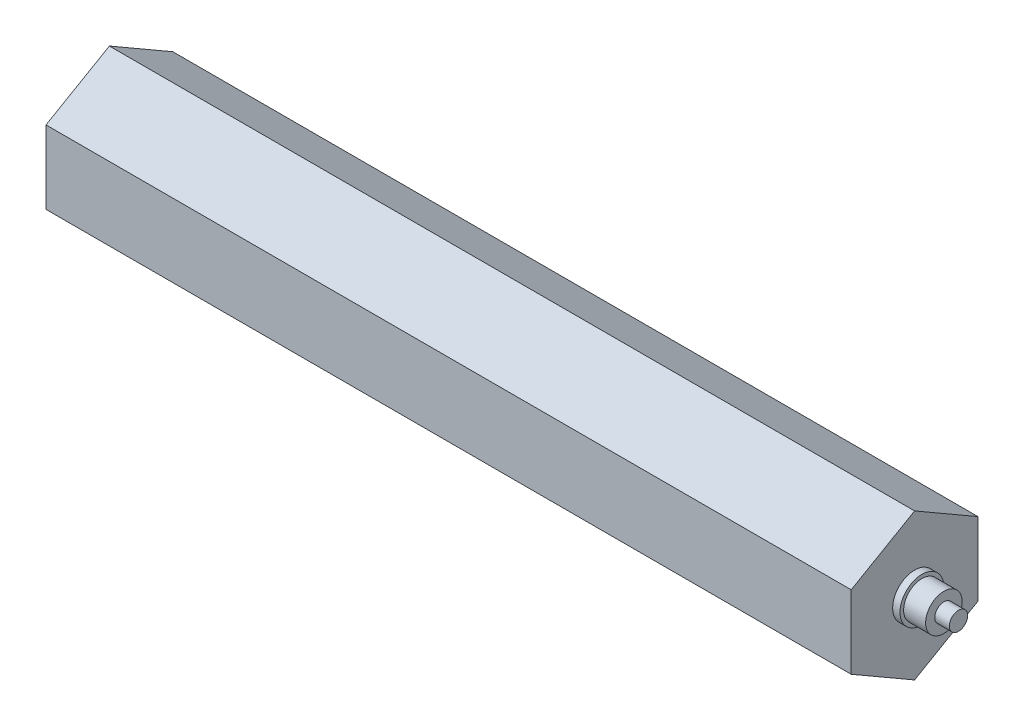
ISO-10303-21;
HEADER;
FILE_DESCRIPTION(('STEP AP214'),'2;1');
FILE_NAME('part.step','',(''),(''),'','','');
FILE_SCHEMA(('AUTOMOTIVE_DESIGN { 1 0 10303 214 1 1 1 1 }'));
ENDSEC;
DATA;
#1=APPLICATION_CONTEXT('core data for automotive mechanical design processes');
#2=APPLICATION_PROTOCOL_DEFINITION('international standard','automotive_design',2000,#1);
#3=PRODUCT_CONTEXT('',#1,'mechanical');
#4=PRODUCT('Part','Part','',(#3));
#5=PRODUCT_RELATED_PRODUCT_CATEGORY('part','',(#4));
#6=PRODUCT_DEFINITION_FORMATION('','',#4);
#7=PRODUCT_DEFINITION_CONTEXT('part definition',#1,'design');
#8=PRODUCT_DEFINITION('design','',#6,#7);
#9=PRODUCT_DEFINITION_SHAPE('','',#8);
#10=(LENGTH_UNIT() NAMED_UNIT(*) SI_UNIT(.MILLI.,.METRE.));
#11=(NAMED_UNIT(*) PLANE_ANGLE_UNIT() SI_UNIT($,.RADIAN.));
#12=(NAMED_UNIT(*) SI_UNIT($,.STERADIAN.) SOLID_ANGLE_UNIT());
#13=UNCERTAINTY_MEASURE_WITH_UNIT(LENGTH_MEASURE(1.E-05),#10,'distance_accuracy_value','');
#14=(GEOMETRIC_REPRESENTATION_CONTEXT(3) GLOBAL_UNCERTAINTY_ASSIGNED_CONTEXT((#13)) GLOBAL_UNIT_ASSIGNED_CONTEXT((#10,
#11,#12)) REPRESENTATION_CONTEXT('',''));
#15=CARTESIAN_POINT('',(0.,0.,0.));
#16=DIRECTION('',(0.,0.,1.));
#17=DIRECTION('',(1.,0.,0.));
#18=AXIS2_PLACEMENT_3D('',#15,#16,#17);
#19=CARTESIAN_POINT('',(220.,-20.,0.));
#20=DIRECTION('',(0.,0.866025403784439,0.5));
#21=DIRECTION('',(0.,-0.5,0.866025403784439));
#22=AXIS2_PLACEMENT_3D('',#19,#20,#21);
#23=PLANE('',#22);
#24=DIRECTION('',(0.,0.5,-0.866025403784438));
#25=VECTOR('',#24,1.);
#26=CARTESIAN_POINT('',(0.,-20.,0.));
#27=LINE('',#26,#25);
#28=CARTESIAN_POINT('',(0.,-20.,0.));
#29=VERTEX_POINT('',#28);
#30=CARTESIAN_POINT('',(0.,-10.,-17.3205080756888));
#31=VERTEX_POINT('',#30);
#32=EDGE_CURVE('E132',#29,#31,#27,.T.);
#33=ORIENTED_EDGE('',*,*,#32,.T.);
#34=DIRECTION('',(-1.,0.,0.));
#35=VECTOR('',#34,1.);
#36=CARTESIAN_POINT('',(220.,-10.,-17.3205080756888));
#37=LINE('',#36,#35);
#38=CARTESIAN_POINT('',(220.,-10.,-17.3205080756888));
#39=VERTEX_POINT('',#38);
#40=EDGE_CURVE('E54',#39,#31,#37,.T.);
#41=ORIENTED_EDGE('',*,*,#40,.F.);
#42=DIRECTION('',(0.,0.5,-0.866025403784438));
#43=VECTOR('',#42,1.);
#44=CARTESIAN_POINT('',(220.,-20.,0.));
#45=LINE('',#44,#43);
#46=CARTESIAN_POINT('',(220.,-20.,0.));
#47=VERTEX_POINT('',#46);
#48=EDGE_CURVE('E143',#47,#39,#45,.T.);
#49=ORIENTED_EDGE('',*,*,#48,.F.);
#50=DIRECTION('',(-1.,0.,0.));
#51=VECTOR('',#50,1.);
#52=CARTESIAN_POINT('',(220.,-20.,0.));
#53=LINE('',#52,#51);
#54=EDGE_CURVE('E128',#47,#29,#53,.T.);
#55=ORIENTED_EDGE('',*,*,#54,.T.);
#56=EDGE_LOOP('',(#33,#41,#49,#55));
#57=FACE_BOUND('',#56,.T.);
#58=ADVANCED_FACE('F45',(#57),#23,.F.);
#59=CARTESIAN_POINT('',(220.,-10.,-17.3205080756888));
#60=DIRECTION('',(0.,0.,1.));
#61=DIRECTION('',(0.,-1.,0.));
#62=AXIS2_PLACEMENT_3D('',#59,#60,#61);
#63=PLANE('',#62);
#64=DIRECTION('',(0.,1.,0.));
#65=VECTOR('',#64,1.);
#66=CARTESIAN_POINT('',(0.,-10.,-17.3205080756888));
#67=LINE('',#66,#65);
#68=CARTESIAN_POINT('',(0.,10.,-17.3205080756888));
#69=VERTEX_POINT('',#68);
#70=EDGE_CURVE('E135',#31,#69,#67,.T.);
#71=ORIENTED_EDGE('',*,*,#70,.T.);
#72=DIRECTION('',(-1.,0.,0.));
#73=VECTOR('',#72,1.);
#74=CARTESIAN_POINT('',(220.,10.,-17.3205080756888));
#75=LINE('',#74,#73);
#76=CARTESIAN_POINT('',(220.,10.,-17.3205080756888));
#77=VERTEX_POINT('',#76);
#78=EDGE_CURVE('E147',#77,#69,#75,.T.);
#79=ORIENTED_EDGE('',*,*,#78,.F.);
#80=DIRECTION('',(0.,1.,0.));
#81=VECTOR('',#80,1.);
#82=CARTESIAN_POINT('',(220.,-10.,-17.3205080756888));
#83=LINE('',#82,#81);
#84=EDGE_CURVE('E101',#39,#77,#83,.T.);
#85=ORIENTED_EDGE('',*,*,#84,.F.);
#86=ORIENTED_EDGE('',*,*,#40,.T.);
#87=EDGE_LOOP('',(#71,#79,#85,#86));
#88=FACE_BOUND('',#87,.T.);
#89=ADVANCED_FACE('F150',(#88),#63,.F.);
#90=CARTESIAN_POINT('',(220.,10.,-17.3205080756888));
#91=DIRECTION('',(0.,-0.866025403784439,0.5));
#92=DIRECTION('',(0.,-0.5,-0.866025403784439));
#93=AXIS2_PLACEMENT_3D('',#90,#91,#92);
#94=PLANE('',#93);
#95=DIRECTION('',(0.,0.5,0.866025403784439));
#96=VECTOR('',#95,1.);
#97=CARTESIAN_POINT('',(0.,10.,-17.3205080756888));
#98=LINE('',#97,#96);
#99=CARTESIAN_POINT('',(0.,20.,0.));
#100=VERTEX_POINT('',#99);
#101=EDGE_CURVE('E138',#69,#100,#98,.T.);
#102=ORIENTED_EDGE('',*,*,#101,.T.);
#103=DIRECTION('',(-1.,0.,0.));
#104=VECTOR('',#103,1.);
#105=CARTESIAN_POINT('',(220.,20.,0.));
#106=LINE('',#105,#104);
#107=CARTESIAN_POINT('',(220.,20.,0.));
#108=VERTEX_POINT('',#107);
#109=EDGE_CURVE('E123',#108,#100,#106,.T.);
#110=ORIENTED_EDGE('',*,*,#109,.F.);
#111=DIRECTION('',(0.,0.5,0.866025403784439));
#112=VECTOR('',#111,1.);
#113=CARTESIAN_POINT('',(220.,10.,-17.3205080756888));
#114=LINE('',#113,#112);
#115=EDGE_CURVE('E114',#77,#108,#114,.T.);
#116=ORIENTED_EDGE('',*,*,#115,.F.);
#117=ORIENTED_EDGE('',*,*,#78,.T.);
#118=EDGE_LOOP('',(#102,#110,#116,#117));
#119=FACE_BOUND('',#118,.T.);
#120=ADVANCED_FACE('F158',(#119),#94,.F.);
#121=CARTESIAN_POINT('',(220.,20.,0.));
#122=DIRECTION('',(0.,-0.866025403784439,-0.5));
#123=DIRECTION('',(0.,0.5,-0.866025403784439));
#124=AXIS2_PLACEMENT_3D('',#121,#122,#123);
#125=PLANE('',#124);
#126=DIRECTION('',(0.,-0.5,0.866025403784439));
#127=VECTOR('',#126,1.);
#128=CARTESIAN_POINT('',(0.,20.,0.));
#129=LINE('',#128,#127);
#130=CARTESIAN_POINT('',(0.,10.,17.3205080756888));
#131=VERTEX_POINT('',#130);
#132=EDGE_CURVE('E122',#100,#131,#129,.T.);
#133=ORIENTED_EDGE('',*,*,#132,.T.);
#134=DIRECTION('',(-1.,0.,0.));
#135=VECTOR('',#134,1.);
#136=CARTESIAN_POINT('',(220.,10.,17.3205080756888));
#137=LINE('',#136,#135);
#138=CARTESIAN_POINT('',(220.,10.,17.3205080756888));
#139=VERTEX_POINT('',#138);
#140=EDGE_CURVE('E119',#139,#131,#137,.T.);
#141=ORIENTED_EDGE('',*,*,#140,.F.);
#142=DIRECTION('',(0.,-0.5,0.866025403784439));
#143=VECTOR('',#142,1.);
#144=CARTESIAN_POINT('',(220.,20.,0.));
#145=LINE('',#144,#143);
#146=EDGE_CURVE('E108',#108,#139,#145,.T.);
#147=ORIENTED_EDGE('',*,*,#146,.F.);
#148=ORIENTED_EDGE('',*,*,#109,.T.);
#149=EDGE_LOOP('',(#133,#141,#147,#148));
#150=FACE_BOUND('',#149,.T.);
#151=ADVANCED_FACE('F120',(#150),#125,.F.);
#152=CARTESIAN_POINT('',(220.,10.,17.3205080756888));
#153=DIRECTION('',(0.,0.,-1.));
#154=DIRECTION('',(-1.,0.,0.));
#155=AXIS2_PLACEMENT_3D('',#152,#153,#154);
#156=PLANE('',#155);
#157=DIRECTION('',(0.,-1.,0.));
#158=VECTOR('',#157,1.);
#159=CARTESIAN_POINT('',(0.,10.,17.3205080756888));
#160=LINE('',#159,#158);
#161=CARTESIAN_POINT('',(0.,-10.,17.3205080756888));
#162=VERTEX_POINT('',#161);
#163=EDGE_CURVE('E86',#131,#162,#160,.T.);
#164=ORIENTED_EDGE('',*,*,#163,.T.);
#165=DIRECTION('',(-1.,0.,0.));
#166=VECTOR('',#165,1.);
#167=CARTESIAN_POINT('',(220.,-10.,17.3205080756888));
#168=LINE('',#167,#166);
#169=CARTESIAN_POINT('',(220.,-10.,17.3205080756888));
#170=VERTEX_POINT('',#169);
#171=EDGE_CURVE('E124',#170,#162,#168,.T.);
#172=ORIENTED_EDGE('',*,*,#171,.F.);
#173=DIRECTION('',(0.,-1.,0.));
#174=VECTOR('',#173,1.);
#175=CARTESIAN_POINT('',(220.,10.,17.3205080756888));
#176=LINE('',#175,#174);
#177=EDGE_CURVE('E112',#139,#170,#176,.T.);
#178=ORIENTED_EDGE('',*,*,#177,.F.);
#179=ORIENTED_EDGE('',*,*,#140,.T.);
#180=EDGE_LOOP('',(#164,#172,#178,#179));
#181=FACE_BOUND('',#180,.T.);
#182=ADVANCED_FACE('F126',(#181),#156,.F.);
#183=CARTESIAN_POINT('',(220.,-10.,17.3205080756888));
#184=DIRECTION('',(0.,0.866025403784439,-0.5));
#185=DIRECTION('',(0.,0.5,0.866025403784439));
#186=AXIS2_PLACEMENT_3D('',#183,#184,#185);
#187=PLANE('',#186);
#188=DIRECTION('',(0.,-0.5,-0.866025403784439));
#189=VECTOR('',#188,1.);
#190=CARTESIAN_POINT('',(0.,-10.,17.3205080756888));
#191=LINE('',#190,#189);
#192=EDGE_CURVE('E92',#162,#29,#191,.T.);
#193=ORIENTED_EDGE('',*,*,#192,.T.);
#194=ORIENTED_EDGE('',*,*,#54,.F.);
#195=DIRECTION('',(0.,-0.5,-0.866025403784439));
#196=VECTOR('',#195,1.);
#197=CARTESIAN_POINT('',(220.,-10.,17.3205080756888));
#198=LINE('',#197,#196);
#199=EDGE_CURVE('E63',#170,#47,#198,.T.);
#200=ORIENTED_EDGE('',*,*,#199,.F.);
#201=ORIENTED_EDGE('',*,*,#171,.T.);
#202=EDGE_LOOP('',(#193,#194,#200,#201));
#203=FACE_BOUND('',#202,.T.);
#204=ADVANCED_FACE('F211',(#203),#187,.F.);
#205=CARTESIAN_POINT('',(220.,0.,0.));
#206=DIRECTION('',(1.,0.,0.));
#207=DIRECTION('',(0.,0.,-1.));
#208=AXIS2_PLACEMENT_3D('',#205,#206,#207);
#209=PLANE('',#208);
#210=CARTESIAN_POINT('',(220.,0.,0.));
#211=DIRECTION('',(1.,0.,0.));
#212=DIRECTION('',(0.,0.,-1.));
#213=AXIS2_PLACEMENT_3D('',#210,#211,#212);
#214=CIRCLE('',#213,6.);
#215=CARTESIAN_POINT('',(220.,0.,-6.));
#216=VERTEX_POINT('',#215);
#217=EDGE_CURVE('E164',#216,#216,#214,.T.);
#218=ORIENTED_EDGE('',*,*,#217,.F.);
#219=EDGE_LOOP('',(#218));
#220=FACE_BOUND('',#219,.T.);
#221=ORIENTED_EDGE('',*,*,#48,.T.);
#222=ORIENTED_EDGE('',*,*,#84,.T.);
#223=ORIENTED_EDGE('',*,*,#115,.T.);
#224=ORIENTED_EDGE('',*,*,#146,.T.);
#225=ORIENTED_EDGE('',*,*,#177,.T.);
#226=ORIENTED_EDGE('',*,*,#199,.T.);
#227=EDGE_LOOP('',(#221,#222,#223,#224,#225,#226));
#228=FACE_BOUND('',#227,.T.);
#229=ADVANCED_FACE('F110',(#220,#228),#209,.T.);
#230=CARTESIAN_POINT('',(0.,0.,0.));
#231=DIRECTION('',(1.,0.,0.));
#232=DIRECTION('',(0.,0.,-1.));
#233=AXIS2_PLACEMENT_3D('',#230,#231,#232);
#234=PLANE('',#233);
#235=ORIENTED_EDGE('',*,*,#32,.F.);
#236=ORIENTED_EDGE('',*,*,#192,.F.);
#237=ORIENTED_EDGE('',*,*,#163,.F.);
#238=ORIENTED_EDGE('',*,*,#132,.F.);
#239=ORIENTED_EDGE('',*,*,#101,.F.);
#240=ORIENTED_EDGE('',*,*,#70,.F.);
#241=EDGE_LOOP('',(#235,#236,#237,#238,#239,#240));
#242=FACE_BOUND('',#241,.T.);
#243=ADVANCED_FACE('F155',(#242),#234,.F.);
#244=CARTESIAN_POINT('',(222.,0.,0.));
#245=DIRECTION('',(-1.,0.,0.));
#246=DIRECTION('',(0.,0.,1.));
#247=AXIS2_PLACEMENT_3D('',#244,#245,#246);
#248=CYLINDRICAL_SURFACE('',#247,6.);
#249=CARTESIAN_POINT('',(222.,0.,0.));
#250=DIRECTION('',(1.,0.,0.));
#251=DIRECTION('',(0.,0.,-1.));
#252=AXIS2_PLACEMENT_3D('',#249,#250,#251);
#253=CIRCLE('',#252,6.);
#254=CARTESIAN_POINT('',(222.,0.,-6.));
#255=VERTEX_POINT('',#254);
#256=EDGE_CURVE('E167',#255,#255,#253,.T.);
#257=ORIENTED_EDGE('',*,*,#256,.F.);
#258=EDGE_LOOP('',(#257));
#259=FACE_BOUND('',#258,.T.);
#260=ORIENTED_EDGE('',*,*,#217,.T.);
#261=EDGE_LOOP('',(#260));
#262=FACE_BOUND('',#261,.T.);
#263=ADVANCED_FACE('F215',(#259,#262),#248,.T.);
#264=CARTESIAN_POINT('',(222.,0.,0.));
#265=DIRECTION('',(1.,0.,0.));
#266=DIRECTION('',(0.,0.,-1.));
#267=AXIS2_PLACEMENT_3D('',#264,#265,#266);
#268=PLANE('',#267);
#269=CARTESIAN_POINT('',(222.,0.,0.));
#270=DIRECTION('',(1.,0.,0.));
#271=DIRECTION('',(0.,0.,-1.));
#272=AXIS2_PLACEMENT_3D('',#269,#270,#271);
#273=CIRCLE('',#272,5.);
#274=CARTESIAN_POINT('',(222.,0.,-5.));
#275=VERTEX_POINT('',#274);
#276=EDGE_CURVE('E48',#275,#275,#273,.T.);
#277=ORIENTED_EDGE('',*,*,#276,.F.);
#278=EDGE_LOOP('',(#277));
#279=FACE_BOUND('',#278,.T.);
#280=ORIENTED_EDGE('',*,*,#256,.T.);
#281=EDGE_LOOP('',(#280));
#282=FACE_BOUND('',#281,.T.);
#283=ADVANCED_FACE('F186',(#279,#282),#268,.T.);
#284=CARTESIAN_POINT('',(228.,0.,0.));
#285=DIRECTION('',(1.,0.,0.));
#286=DIRECTION('',(0.,0.,-1.));
#287=AXIS2_PLACEMENT_3D('',#284,#285,#286);
#288=PLANE('',#287);
#289=CARTESIAN_POINT('',(228.,0.,0.));
#290=DIRECTION('',(1.,0.,0.));
#291=DIRECTION('',(0.,0.,-1.));
#292=AXIS2_PLACEMENT_3D('',#289,#290,#291);
#293=CIRCLE('',#292,2.5);
#294=CARTESIAN_POINT('',(228.,0.,-2.5));
#295=VERTEX_POINT('',#294);
#296=EDGE_CURVE('E11',#295,#295,#293,.T.);
#297=ORIENTED_EDGE('',*,*,#296,.F.);
#298=EDGE_LOOP('',(#297));
#299=FACE_BOUND('',#298,.T.);
#300=CARTESIAN_POINT('',(228.,0.,0.));
#301=DIRECTION('',(1.,0.,0.));
#302=DIRECTION('',(0.,0.,-1.));
#303=AXIS2_PLACEMENT_3D('',#300,#301,#302);
#304=CIRCLE('',#303,5.);
#305=CARTESIAN_POINT('',(228.,0.,-5.));
#306=VERTEX_POINT('',#305);
#307=EDGE_CURVE('E136',#306,#306,#304,.T.);
#308=ORIENTED_EDGE('',*,*,#307,.T.);
#309=EDGE_LOOP('',(#308));
#310=FACE_BOUND('',#309,.T.);
#311=ADVANCED_FACE('F183',(#299,#310),#288,.T.);
#312=CARTESIAN_POINT('',(228.,0.,0.));
#313=DIRECTION('',(-1.,0.,0.));
#314=DIRECTION('',(0.,0.,1.));
#315=AXIS2_PLACEMENT_3D('',#312,#313,#314);
#316=CYLINDRICAL_SURFACE('',#315,5.);
#317=ORIENTED_EDGE('',*,*,#276,.T.);
#318=EDGE_LOOP('',(#317));
#319=FACE_BOUND('',#318,.T.);
#320=ORIENTED_EDGE('',*,*,#307,.F.);
#321=EDGE_LOOP('',(#320));
#322=FACE_BOUND('',#321,.T.);
#323=ADVANCED_FACE('F179',(#319,#322),#316,.T.);
#324=CARTESIAN_POINT('',(232.,0.,0.));
#325=DIRECTION('',(-1.,0.,0.));
#326=DIRECTION('',(0.,0.,1.));
#327=AXIS2_PLACEMENT_3D('',#324,#325,#326);
#328=CYLINDRICAL_SURFACE('',#327,2.5);
#329=CARTESIAN_POINT('',(232.,0.,0.));
#330=DIRECTION('',(1.,0.,0.));
#331=DIRECTION('',(0.,0.,-1.));
#332=AXIS2_PLACEMENT_3D('',#329,#330,#331);
#333=CIRCLE('',#332,2.5);
#334=CARTESIAN_POINT('',(232.,0.,-2.5));
#335=VERTEX_POINT('',#334);
#336=EDGE_CURVE('E168',#335,#335,#333,.T.);
#337=ORIENTED_EDGE('',*,*,#336,.F.);
#338=EDGE_LOOP('',(#337));
#339=FACE_BOUND('',#338,.T.);
#340=ORIENTED_EDGE('',*,*,#296,.T.);
#341=EDGE_LOOP('',(#340));
#342=FACE_BOUND('',#341,.T.);
#343=ADVANCED_FACE('F176',(#339,#342),#328,.T.);
#344=CARTESIAN_POINT('',(232.,0.,0.));
#345=DIRECTION('',(1.,0.,0.));
#346=DIRECTION('',(0.,0.,-1.));
#347=AXIS2_PLACEMENT_3D('',#344,#345,#346);
#348=PLANE('',#347);
#349=ORIENTED_EDGE('',*,*,#336,.T.);
#350=EDGE_LOOP('',(#349));
#351=FACE_BOUND('',#350,.T.);
#352=ADVANCED_FACE('F174',(#351),#348,.T.);
#353=CLOSED_SHELL('',(#58,#89,#120,#151,#182,#204,#229,#243,#263,#283,#311,#323,#343,#352));
#354=MANIFOLD_SOLID_BREP('B2',#353);
#355=ADVANCED_BREP_SHAPE_REPRESENTATION('',(#18,#354),#14);
#356=SHAPE_DEFINITION_REPRESENTATION(#9,#355);
ENDSEC;
END-ISO-10303-21;
